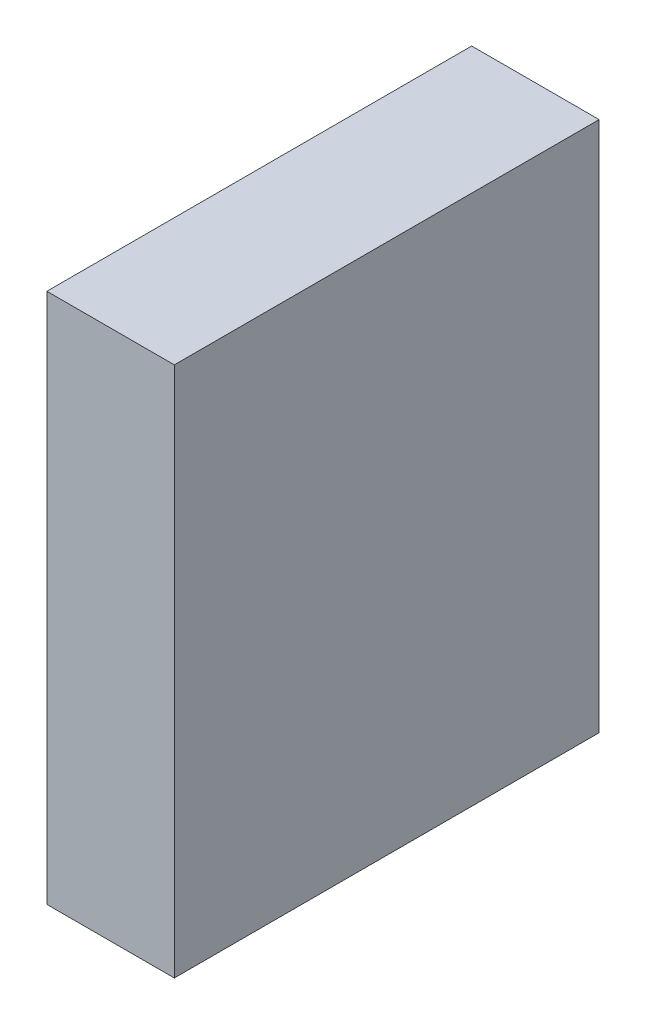
ISO-10303-21;
HEADER;
FILE_DESCRIPTION(('STEP AP214'),'2;1');
FILE_NAME('part.step','',(''),(''),'','','');
FILE_SCHEMA(('AUTOMOTIVE_DESIGN { 1 0 10303 214 1 1 1 1 }'));
ENDSEC;
DATA;
#1=APPLICATION_CONTEXT('core data for automotive mechanical design processes');
#2=APPLICATION_PROTOCOL_DEFINITION('international standard','automotive_design',2000,#1);
#3=PRODUCT_CONTEXT('',#1,'mechanical');
#4=PRODUCT('Part','Part','',(#3));
#5=PRODUCT_RELATED_PRODUCT_CATEGORY('part','',(#4));
#6=PRODUCT_DEFINITION_FORMATION('','',#4);
#7=PRODUCT_DEFINITION_CONTEXT('part definition',#1,'design');
#8=PRODUCT_DEFINITION('design','',#6,#7);
#9=PRODUCT_DEFINITION_SHAPE('','',#8);
#10=(LENGTH_UNIT() NAMED_UNIT(*) SI_UNIT(.MILLI.,.METRE.));
#11=(NAMED_UNIT(*) PLANE_ANGLE_UNIT() SI_UNIT($,.RADIAN.));
#12=(NAMED_UNIT(*) SI_UNIT($,.STERADIAN.) SOLID_ANGLE_UNIT());
#13=UNCERTAINTY_MEASURE_WITH_UNIT(LENGTH_MEASURE(1.E-05),#10,'distance_accuracy_value','');
#14=(GEOMETRIC_REPRESENTATION_CONTEXT(3) GLOBAL_UNCERTAINTY_ASSIGNED_CONTEXT((#13)) GLOBAL_UNIT_ASSIGNED_CONTEXT((#10,
#11,#12)) REPRESENTATION_CONTEXT('',''));
#15=CARTESIAN_POINT('',(0.,0.,0.));
#16=DIRECTION('',(0.,0.,1.));
#17=DIRECTION('',(1.,0.,0.));
#18=AXIS2_PLACEMENT_3D('',#15,#16,#17);
#19=CARTESIAN_POINT('',(15.,-62.5,49.9999999999998));
#20=DIRECTION('',(0.,0.,-1.));
#21=DIRECTION('',(-1.,0.,0.));
#22=AXIS2_PLACEMENT_3D('',#19,#20,#21);
#23=PLANE('',#22);
#24=DIRECTION('',(0.,-1.,0.));
#25=VECTOR('',#24,1.);
#26=CARTESIAN_POINT('',(-15.,-62.5,49.9999999999998));
#27=LINE('',#26,#25);
#28=CARTESIAN_POINT('',(-15.,62.5,49.9999999999998));
#29=VERTEX_POINT('',#28);
#30=CARTESIAN_POINT('',(-15.,-62.5,49.9999999999998));
#31=VERTEX_POINT('',#30);
#32=EDGE_CURVE('E102',#29,#31,#27,.T.);
#33=ORIENTED_EDGE('',*,*,#32,.T.);
#34=DIRECTION('',(-1.,0.,0.));
#35=VECTOR('',#34,1.);
#36=CARTESIAN_POINT('',(15.,-62.5,49.9999999999998));
#37=LINE('',#36,#35);
#38=CARTESIAN_POINT('',(15.,-62.5,49.9999999999998));
#39=VERTEX_POINT('',#38);
#40=EDGE_CURVE('E11',#39,#31,#37,.T.);
#41=ORIENTED_EDGE('',*,*,#40,.F.);
#42=DIRECTION('',(0.,-1.,0.));
#43=VECTOR('',#42,1.);
#44=CARTESIAN_POINT('',(15.,-62.5,49.9999999999998));
#45=LINE('',#44,#43);
#46=CARTESIAN_POINT('',(15.,62.5,49.9999999999998));
#47=VERTEX_POINT('',#46);
#48=EDGE_CURVE('E90',#47,#39,#45,.T.);
#49=ORIENTED_EDGE('',*,*,#48,.F.);
#50=DIRECTION('',(-1.,0.,0.));
#51=VECTOR('',#50,1.);
#52=CARTESIAN_POINT('',(15.,62.5,49.9999999999998));
#53=LINE('',#52,#51);
#54=EDGE_CURVE('E98',#47,#29,#53,.T.);
#55=ORIENTED_EDGE('',*,*,#54,.T.);
#56=EDGE_LOOP('',(#33,#41,#49,#55));
#57=FACE_BOUND('',#56,.T.);
#58=ADVANCED_FACE('F39',(#57),#23,.F.);
#59=CARTESIAN_POINT('',(15.,-62.5,-50.0000000000002));
#60=DIRECTION('',(0.,1.,0.));
#61=DIRECTION('',(0.,0.,1.));
#62=AXIS2_PLACEMENT_3D('',#59,#60,#61);
#63=PLANE('',#62);
#64=DIRECTION('',(0.,0.,-1.));
#65=VECTOR('',#64,1.);
#66=CARTESIAN_POINT('',(-15.,-62.5,-50.0000000000002));
#67=LINE('',#66,#65);
#68=CARTESIAN_POINT('',(-15.,-62.5,-50.0000000000002));
#69=VERTEX_POINT('',#68);
#70=EDGE_CURVE('E94',#31,#69,#67,.T.);
#71=ORIENTED_EDGE('',*,*,#70,.T.);
#72=DIRECTION('',(-1.,0.,0.));
#73=VECTOR('',#72,1.);
#74=CARTESIAN_POINT('',(15.,-62.5,-50.0000000000002));
#75=LINE('',#74,#73);
#76=CARTESIAN_POINT('',(15.,-62.5,-50.0000000000002));
#77=VERTEX_POINT('',#76);
#78=EDGE_CURVE('E47',#77,#69,#75,.T.);
#79=ORIENTED_EDGE('',*,*,#78,.F.);
#80=DIRECTION('',(0.,0.,-1.));
#81=VECTOR('',#80,1.);
#82=CARTESIAN_POINT('',(15.,-62.5,-50.0000000000002));
#83=LINE('',#82,#81);
#84=EDGE_CURVE('E85',#39,#77,#83,.T.);
#85=ORIENTED_EDGE('',*,*,#84,.F.);
#86=ORIENTED_EDGE('',*,*,#40,.T.);
#87=EDGE_LOOP('',(#71,#79,#85,#86));
#88=FACE_BOUND('',#87,.T.);
#89=ADVANCED_FACE('F93',(#88),#63,.F.);
#90=CARTESIAN_POINT('',(15.,-62.5,-50.0000000000002));
#91=DIRECTION('',(0.,0.,1.));
#92=DIRECTION('',(1.,0.,0.));
#93=AXIS2_PLACEMENT_3D('',#90,#91,#92);
#94=PLANE('',#93);
#95=DIRECTION('',(0.,1.,0.));
#96=VECTOR('',#95,1.);
#97=CARTESIAN_POINT('',(-15.,-62.5,-50.0000000000002));
#98=LINE('',#97,#96);
#99=CARTESIAN_POINT('',(-15.,62.5,-50.0000000000002));
#100=VERTEX_POINT('',#99);
#101=EDGE_CURVE('E72',#69,#100,#98,.T.);
#102=ORIENTED_EDGE('',*,*,#101,.T.);
#103=DIRECTION('',(-1.,0.,0.));
#104=VECTOR('',#103,1.);
#105=CARTESIAN_POINT('',(15.,62.5,-50.0000000000002));
#106=LINE('',#105,#104);
#107=CARTESIAN_POINT('',(15.,62.5,-50.0000000000002));
#108=VERTEX_POINT('',#107);
#109=EDGE_CURVE('E95',#108,#100,#106,.T.);
#110=ORIENTED_EDGE('',*,*,#109,.F.);
#111=DIRECTION('',(0.,1.,0.));
#112=VECTOR('',#111,1.);
#113=CARTESIAN_POINT('',(15.,-62.5,-50.0000000000002));
#114=LINE('',#113,#112);
#115=EDGE_CURVE('E88',#77,#108,#114,.T.);
#116=ORIENTED_EDGE('',*,*,#115,.F.);
#117=ORIENTED_EDGE('',*,*,#78,.T.);
#118=EDGE_LOOP('',(#102,#110,#116,#117));
#119=FACE_BOUND('',#118,.T.);
#120=ADVANCED_FACE('F96',(#119),#94,.F.);
#121=CARTESIAN_POINT('',(15.,62.5,-50.0000000000002));
#122=DIRECTION('',(0.,-1.,0.));
#123=DIRECTION('',(0.,0.,-1.));
#124=AXIS2_PLACEMENT_3D('',#121,#122,#123);
#125=PLANE('',#124);
#126=DIRECTION('',(0.,0.,1.));
#127=VECTOR('',#126,1.);
#128=CARTESIAN_POINT('',(-15.,62.5,-50.0000000000002));
#129=LINE('',#128,#127);
#130=EDGE_CURVE('E78',#100,#29,#129,.T.);
#131=ORIENTED_EDGE('',*,*,#130,.T.);
#132=ORIENTED_EDGE('',*,*,#54,.F.);
#133=DIRECTION('',(0.,0.,1.));
#134=VECTOR('',#133,1.);
#135=CARTESIAN_POINT('',(15.,62.5,-50.0000000000002));
#136=LINE('',#135,#134);
#137=EDGE_CURVE('E55',#108,#47,#136,.T.);
#138=ORIENTED_EDGE('',*,*,#137,.F.);
#139=ORIENTED_EDGE('',*,*,#109,.T.);
#140=EDGE_LOOP('',(#131,#132,#138,#139));
#141=FACE_BOUND('',#140,.T.);
#142=ADVANCED_FACE('F109',(#141),#125,.F.);
#143=CARTESIAN_POINT('',(15.,0.,0.));
#144=DIRECTION('',(1.,0.,0.));
#145=DIRECTION('',(0.,0.,-1.));
#146=AXIS2_PLACEMENT_3D('',#143,#144,#145);
#147=PLANE('',#146);
#148=ORIENTED_EDGE('',*,*,#48,.T.);
#149=ORIENTED_EDGE('',*,*,#84,.T.);
#150=ORIENTED_EDGE('',*,*,#115,.T.);
#151=ORIENTED_EDGE('',*,*,#137,.T.);
#152=EDGE_LOOP('',(#148,#149,#150,#151));
#153=FACE_BOUND('',#152,.T.);
#154=ADVANCED_FACE('F86',(#153),#147,.T.);
#155=CARTESIAN_POINT('',(-15.,0.,0.));
#156=DIRECTION('',(1.,0.,0.));
#157=DIRECTION('',(0.,0.,-1.));
#158=AXIS2_PLACEMENT_3D('',#155,#156,#157);
#159=PLANE('',#158);
#160=ORIENTED_EDGE('',*,*,#32,.F.);
#161=ORIENTED_EDGE('',*,*,#130,.F.);
#162=ORIENTED_EDGE('',*,*,#101,.F.);
#163=ORIENTED_EDGE('',*,*,#70,.F.);
#164=EDGE_LOOP('',(#160,#161,#162,#163));
#165=FACE_BOUND('',#164,.T.);
#166=ADVANCED_FACE('F112',(#165),#159,.F.);
#167=CLOSED_SHELL('',(#58,#89,#120,#142,#154,#166));
#168=MANIFOLD_SOLID_BREP('B2',#167);
#169=ADVANCED_BREP_SHAPE_REPRESENTATION('',(#18,#168),#14);
#170=SHAPE_DEFINITION_REPRESENTATION(#9,#169);
ENDSEC;
END-ISO-10303-21;
